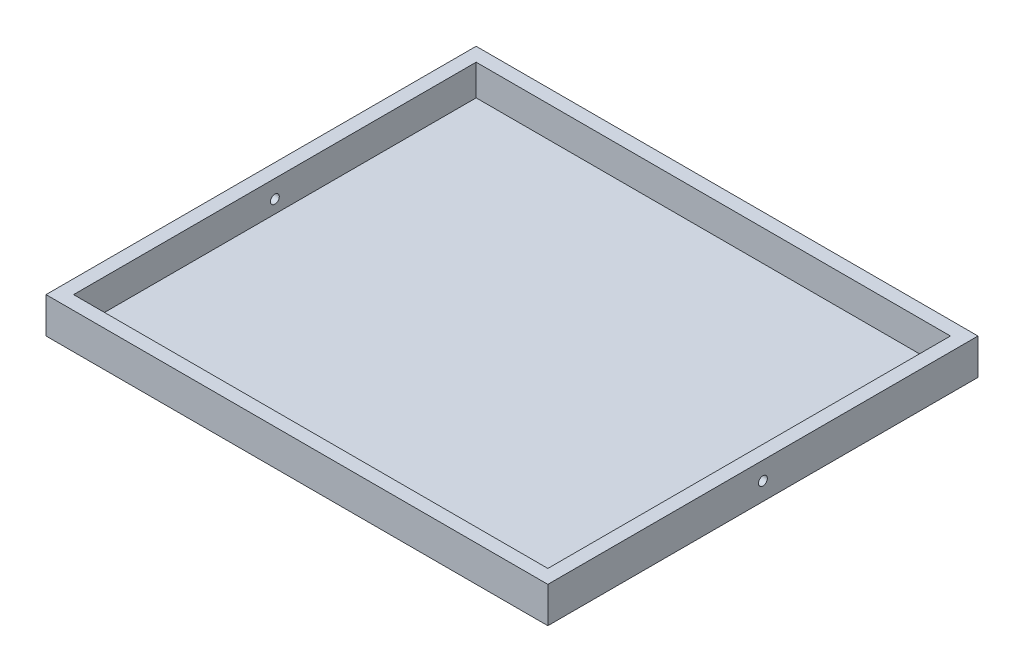
ISO-10303-21;
HEADER;
FILE_DESCRIPTION(('STEP AP214'),'2;1');
FILE_NAME('part.step','',(''),(''),'','','');
FILE_SCHEMA(('AUTOMOTIVE_DESIGN { 1 0 10303 214 1 1 1 1 }'));
ENDSEC;
DATA;
#1=APPLICATION_CONTEXT('core data for automotive mechanical design processes');
#2=APPLICATION_PROTOCOL_DEFINITION('international standard','automotive_design',2000,#1);
#3=PRODUCT_CONTEXT('',#1,'mechanical');
#4=PRODUCT('Part','Part','',(#3));
#5=PRODUCT_RELATED_PRODUCT_CATEGORY('part','',(#4));
#6=PRODUCT_DEFINITION_FORMATION('','',#4);
#7=PRODUCT_DEFINITION_CONTEXT('part definition',#1,'design');
#8=PRODUCT_DEFINITION('design','',#6,#7);
#9=PRODUCT_DEFINITION_SHAPE('','',#8);
#10=(LENGTH_UNIT() NAMED_UNIT(*) SI_UNIT(.MILLI.,.METRE.));
#11=(NAMED_UNIT(*) PLANE_ANGLE_UNIT() SI_UNIT($,.RADIAN.));
#12=(NAMED_UNIT(*) SI_UNIT($,.STERADIAN.) SOLID_ANGLE_UNIT());
#13=UNCERTAINTY_MEASURE_WITH_UNIT(LENGTH_MEASURE(1.E-05),#10,'distance_accuracy_value','');
#14=(GEOMETRIC_REPRESENTATION_CONTEXT(3) GLOBAL_UNCERTAINTY_ASSIGNED_CONTEXT((#13)) GLOBAL_UNIT_ASSIGNED_CONTEXT((#10,
#11,#12)) REPRESENTATION_CONTEXT('',''));
#15=CARTESIAN_POINT('',(0.,0.,0.));
#16=DIRECTION('',(0.,0.,1.));
#17=DIRECTION('',(1.,0.,0.));
#18=AXIS2_PLACEMENT_3D('',#15,#16,#17);
#19=CARTESIAN_POINT('',(-89.3605632411068,20.6375,-33.4056453318521));
#20=DIRECTION('',(1.,0.,0.));
#21=DIRECTION('',(0.,0.,-1.));
#22=AXIS2_PLACEMENT_3D('',#19,#20,#21);
#23=PLANE('',#22);
#24=CARTESIAN_POINT('',(-89.3605632411067,10.31875,82.481854668148));
#25=DIRECTION('',(1.,0.,0.));
#26=DIRECTION('',(0.,0.,-1.));
#27=AXIS2_PLACEMENT_3D('',#24,#25,#26);
#28=CIRCLE('',#27,2.54);
#29=CARTESIAN_POINT('',(-89.3605632411067,10.31875,79.941854668148));
#30=VERTEX_POINT('',#29);
#31=EDGE_CURVE('E118',#30,#30,#28,.T.);
#32=ORIENTED_EDGE('',*,*,#31,.F.);
#33=EDGE_LOOP('',(#32));
#34=FACE_BOUND('',#33,.T.);
#35=DIRECTION('',(0.,-1.,0.));
#36=VECTOR('',#35,1.);
#37=CARTESIAN_POINT('',(-89.3605632411067,20.6375,198.369354668148));
#38=LINE('',#37,#36);
#39=CARTESIAN_POINT('',(-89.3605632411067,20.6375,198.369354668148));
#40=VERTEX_POINT('',#39);
#41=CARTESIAN_POINT('',(-89.3605632411067,2.83961675484079,198.369354668148));
#42=VERTEX_POINT('',#41);
#43=EDGE_CURVE('E116',#40,#42,#38,.T.);
#44=ORIENTED_EDGE('',*,*,#43,.T.);
#45=DIRECTION('',(0.,0.,1.));
#46=VECTOR('',#45,1.);
#47=CARTESIAN_POINT('',(-89.3605632411067,2.83961675484079,198.369354668148));
#48=LINE('',#47,#46);
#49=CARTESIAN_POINT('',(-89.3605632411068,2.83961675484079,-33.4056453318521));
#50=VERTEX_POINT('',#49);
#51=EDGE_CURVE('E104',#50,#42,#48,.T.);
#52=ORIENTED_EDGE('',*,*,#51,.F.);
#53=DIRECTION('',(0.,-1.,0.));
#54=VECTOR('',#53,1.);
#55=CARTESIAN_POINT('',(-89.3605632411068,20.6375,-33.4056453318521));
#56=LINE('',#55,#54);
#57=CARTESIAN_POINT('',(-89.3605632411068,20.6375,-33.4056453318521));
#58=VERTEX_POINT('',#57);
#59=EDGE_CURVE('E113',#58,#50,#56,.T.);
#60=ORIENTED_EDGE('',*,*,#59,.F.);
#61=DIRECTION('',(0.,0.,1.));
#62=VECTOR('',#61,1.);
#63=CARTESIAN_POINT('',(-89.3605632411068,20.6375,-33.4056453318521));
#64=LINE('',#63,#62);
#65=EDGE_CURVE('E250',#58,#40,#64,.T.);
#66=ORIENTED_EDGE('',*,*,#65,.T.);
#67=EDGE_LOOP('',(#44,#52,#60,#66));
#68=FACE_BOUND('',#67,.T.);
#69=ADVANCED_FACE('F38',(#34,#68),#23,.T.);
#70=CARTESIAN_POINT('',(-89.3605632411067,20.6375,198.369354668148));
#71=DIRECTION('',(0.,0.,-1.));
#72=DIRECTION('',(-1.,0.,0.));
#73=AXIS2_PLACEMENT_3D('',#70,#71,#72);
#74=PLANE('',#73);
#75=DIRECTION('',(0.,-1.,0.));
#76=VECTOR('',#75,1.);
#77=CARTESIAN_POINT('',(183.689436758893,20.6375,198.369354668148));
#78=LINE('',#77,#76);
#79=CARTESIAN_POINT('',(183.689436758893,20.6375,198.369354668148));
#80=VERTEX_POINT('',#79);
#81=CARTESIAN_POINT('',(183.689436758893,2.83961675484079,198.369354668148));
#82=VERTEX_POINT('',#81);
#83=EDGE_CURVE('E127',#80,#82,#78,.T.);
#84=ORIENTED_EDGE('',*,*,#83,.T.);
#85=DIRECTION('',(-1.,0.,0.));
#86=VECTOR('',#85,1.);
#87=CARTESIAN_POINT('',(415.481831043767,2.83961675484079,198.369354668148));
#88=LINE('',#87,#86);
#89=EDGE_CURVE('E108',#82,#42,#88,.T.);
#90=ORIENTED_EDGE('',*,*,#89,.T.);
#91=ORIENTED_EDGE('',*,*,#43,.F.);
#92=DIRECTION('',(1.,0.,0.));
#93=VECTOR('',#92,1.);
#94=CARTESIAN_POINT('',(-89.3605632411067,20.6375,198.369354668148));
#95=LINE('',#94,#93);
#96=EDGE_CURVE('E249',#40,#80,#95,.T.);
#97=ORIENTED_EDGE('',*,*,#96,.T.);
#98=EDGE_LOOP('',(#84,#90,#91,#97));
#99=FACE_BOUND('',#98,.T.);
#100=ADVANCED_FACE('F206',(#99),#74,.T.);
#101=CARTESIAN_POINT('',(183.689436758893,20.6375,-33.4056453318521));
#102=DIRECTION('',(-1.,0.,0.));
#103=DIRECTION('',(0.,0.,1.));
#104=AXIS2_PLACEMENT_3D('',#101,#102,#103);
#105=PLANE('',#104);
#106=CARTESIAN_POINT('',(183.689436758893,10.31875,82.4818546681479));
#107=DIRECTION('',(-1.,0.,0.));
#108=DIRECTION('',(0.,0.,1.));
#109=AXIS2_PLACEMENT_3D('',#106,#107,#108);
#110=CIRCLE('',#109,2.54);
#111=CARTESIAN_POINT('',(183.689436758893,10.31875,85.021854668148));
#112=VERTEX_POINT('',#111);
#113=EDGE_CURVE('E244',#112,#112,#110,.T.);
#114=ORIENTED_EDGE('',*,*,#113,.F.);
#115=EDGE_LOOP('',(#114));
#116=FACE_BOUND('',#115,.T.);
#117=DIRECTION('',(0.,-1.,0.));
#118=VECTOR('',#117,1.);
#119=CARTESIAN_POINT('',(183.689436758893,20.6375,-33.4056453318521));
#120=LINE('',#119,#118);
#121=CARTESIAN_POINT('',(183.689436758893,20.6375,-33.4056453318521));
#122=VERTEX_POINT('',#121);
#123=CARTESIAN_POINT('',(183.689436758893,2.83961675484079,-33.4056453318521));
#124=VERTEX_POINT('',#123);
#125=EDGE_CURVE('E61',#122,#124,#120,.T.);
#126=ORIENTED_EDGE('',*,*,#125,.T.);
#127=DIRECTION('',(0.,0.,-1.));
#128=VECTOR('',#127,1.);
#129=CARTESIAN_POINT('',(183.689436758893,2.83961675484079,198.369354668148));
#130=LINE('',#129,#128);
#131=EDGE_CURVE('E54',#82,#124,#130,.T.);
#132=ORIENTED_EDGE('',*,*,#131,.F.);
#133=ORIENTED_EDGE('',*,*,#83,.F.);
#134=DIRECTION('',(0.,0.,-1.));
#135=VECTOR('',#134,1.);
#136=CARTESIAN_POINT('',(183.689436758893,20.6375,-33.4056453318521));
#137=LINE('',#136,#135);
#138=EDGE_CURVE('E129',#80,#122,#137,.T.);
#139=ORIENTED_EDGE('',*,*,#138,.T.);
#140=EDGE_LOOP('',(#126,#132,#133,#139));
#141=FACE_BOUND('',#140,.T.);
#142=ADVANCED_FACE('F214',(#116,#141),#105,.T.);
#143=CARTESIAN_POINT('',(-89.3605632411068,20.6375,-33.4056453318521));
#144=DIRECTION('',(0.,0.,1.));
#145=DIRECTION('',(1.,0.,0.));
#146=AXIS2_PLACEMENT_3D('',#143,#144,#145);
#147=PLANE('',#146);
#148=ORIENTED_EDGE('',*,*,#59,.T.);
#149=DIRECTION('',(-1.,0.,0.));
#150=VECTOR('',#149,1.);
#151=CARTESIAN_POINT('',(415.481831043767,2.83961675484079,-33.4056453318521));
#152=LINE('',#151,#150);
#153=EDGE_CURVE('E101',#124,#50,#152,.T.);
#154=ORIENTED_EDGE('',*,*,#153,.F.);
#155=ORIENTED_EDGE('',*,*,#125,.F.);
#156=DIRECTION('',(-1.,0.,0.));
#157=VECTOR('',#156,1.);
#158=CARTESIAN_POINT('',(-89.3605632411068,20.6375,-33.4056453318521));
#159=LINE('',#158,#157);
#160=EDGE_CURVE('E122',#122,#58,#159,.T.);
#161=ORIENTED_EDGE('',*,*,#160,.T.);
#162=EDGE_LOOP('',(#148,#154,#155,#161));
#163=FACE_BOUND('',#162,.T.);
#164=ADVANCED_FACE('F120',(#163),#147,.T.);
#165=CARTESIAN_POINT('',(0.,20.6375,0.));
#166=DIRECTION('',(0.,1.,0.));
#167=DIRECTION('',(0.,0.,1.));
#168=AXIS2_PLACEMENT_3D('',#165,#166,#167);
#169=PLANE('',#168);
#170=DIRECTION('',(0.,0.,1.));
#171=VECTOR('',#170,1.);
#172=CARTESIAN_POINT('',(-97.2980632411068,20.6375,-41.3431453318521));
#173=LINE('',#172,#171);
#174=CARTESIAN_POINT('',(-97.2980632411068,20.6375,-41.3431453318521));
#175=VERTEX_POINT('',#174);
#176=CARTESIAN_POINT('',(-97.2980632411067,20.6375,206.306854668148));
#177=VERTEX_POINT('',#176);
#178=EDGE_CURVE('E139',#175,#177,#173,.T.);
#179=ORIENTED_EDGE('',*,*,#178,.T.);
#180=DIRECTION('',(1.,0.,0.));
#181=VECTOR('',#180,1.);
#182=CARTESIAN_POINT('',(-97.2980632411067,20.6375,206.306854668148));
#183=LINE('',#182,#181);
#184=CARTESIAN_POINT('',(191.626936758893,20.6375,206.306854668148));
#185=VERTEX_POINT('',#184);
#186=EDGE_CURVE('E143',#177,#185,#183,.T.);
#187=ORIENTED_EDGE('',*,*,#186,.T.);
#188=DIRECTION('',(0.,0.,-1.));
#189=VECTOR('',#188,1.);
#190=CARTESIAN_POINT('',(191.626936758893,20.6375,-41.3431453318521));
#191=LINE('',#190,#189);
#192=CARTESIAN_POINT('',(191.626936758893,20.6375,-41.3431453318521));
#193=VERTEX_POINT('',#192);
#194=EDGE_CURVE('E147',#185,#193,#191,.T.);
#195=ORIENTED_EDGE('',*,*,#194,.T.);
#196=DIRECTION('',(-1.,0.,0.));
#197=VECTOR('',#196,1.);
#198=CARTESIAN_POINT('',(-97.2980632411068,20.6375,-41.3431453318521));
#199=LINE('',#198,#197);
#200=EDGE_CURVE('E150',#193,#175,#199,.T.);
#201=ORIENTED_EDGE('',*,*,#200,.T.);
#202=EDGE_LOOP('',(#179,#187,#195,#201));
#203=FACE_BOUND('',#202,.T.);
#204=ORIENTED_EDGE('',*,*,#96,.F.);
#205=ORIENTED_EDGE('',*,*,#65,.F.);
#206=ORIENTED_EDGE('',*,*,#160,.F.);
#207=ORIENTED_EDGE('',*,*,#138,.F.);
#208=EDGE_LOOP('',(#204,#205,#206,#207));
#209=FACE_BOUND('',#208,.T.);
#210=ADVANCED_FACE('F192',(#203,#209),#169,.T.);
#211=CARTESIAN_POINT('',(0.,0.,0.));
#212=DIRECTION('',(0.,1.,0.));
#213=DIRECTION('',(0.,0.,1.));
#214=AXIS2_PLACEMENT_3D('',#211,#212,#213);
#215=PLANE('',#214);
#216=DIRECTION('',(0.,0.,1.));
#217=VECTOR('',#216,1.);
#218=CARTESIAN_POINT('',(-97.2980632411068,0.,-41.3431453318521));
#219=LINE('',#218,#217);
#220=CARTESIAN_POINT('',(-97.2980632411068,0.,-41.3431453318521));
#221=VERTEX_POINT('',#220);
#222=CARTESIAN_POINT('',(-97.2980632411067,0.,206.306854668148));
#223=VERTEX_POINT('',#222);
#224=EDGE_CURVE('E138',#221,#223,#219,.T.);
#225=ORIENTED_EDGE('',*,*,#224,.F.);
#226=DIRECTION('',(-1.,0.,0.));
#227=VECTOR('',#226,1.);
#228=CARTESIAN_POINT('',(-97.2980632411068,0.,-41.3431453318521));
#229=LINE('',#228,#227);
#230=CARTESIAN_POINT('',(191.626936758893,0.,-41.3431453318521));
#231=VERTEX_POINT('',#230);
#232=EDGE_CURVE('E144',#231,#221,#229,.T.);
#233=ORIENTED_EDGE('',*,*,#232,.F.);
#234=DIRECTION('',(0.,0.,-1.));
#235=VECTOR('',#234,1.);
#236=CARTESIAN_POINT('',(191.626936758893,0.,-41.3431453318521));
#237=LINE('',#236,#235);
#238=CARTESIAN_POINT('',(191.626936758893,0.,206.306854668148));
#239=VERTEX_POINT('',#238);
#240=EDGE_CURVE('E160',#239,#231,#237,.T.);
#241=ORIENTED_EDGE('',*,*,#240,.F.);
#242=DIRECTION('',(1.,0.,0.));
#243=VECTOR('',#242,1.);
#244=CARTESIAN_POINT('',(-97.2980632411067,0.,206.306854668148));
#245=LINE('',#244,#243);
#246=EDGE_CURVE('E157',#223,#239,#245,.T.);
#247=ORIENTED_EDGE('',*,*,#246,.F.);
#248=EDGE_LOOP('',(#225,#233,#241,#247));
#249=FACE_BOUND('',#248,.T.);
#250=ADVANCED_FACE('F183',(#249),#215,.F.);
#251=CARTESIAN_POINT('',(-97.2980632411068,20.6375,-41.3431453318521));
#252=DIRECTION('',(1.,0.,0.));
#253=DIRECTION('',(0.,0.,-1.));
#254=AXIS2_PLACEMENT_3D('',#251,#252,#253);
#255=PLANE('',#254);
#256=CARTESIAN_POINT('',(-97.2980632411068,10.31875,82.481854668148));
#257=DIRECTION('',(1.,0.,0.));
#258=DIRECTION('',(0.,0.,-1.));
#259=AXIS2_PLACEMENT_3D('',#256,#257,#258);
#260=CIRCLE('',#259,2.54);
#261=CARTESIAN_POINT('',(-97.2980632411068,10.31875,79.941854668148));
#262=VERTEX_POINT('',#261);
#263=EDGE_CURVE('E265',#262,#262,#260,.T.);
#264=ORIENTED_EDGE('',*,*,#263,.T.);
#265=EDGE_LOOP('',(#264));
#266=FACE_BOUND('',#265,.T.);
#267=ORIENTED_EDGE('',*,*,#224,.T.);
#268=DIRECTION('',(0.,-1.,0.));
#269=VECTOR('',#268,1.);
#270=CARTESIAN_POINT('',(-97.2980632411067,20.6375,206.306854668148));
#271=LINE('',#270,#269);
#272=EDGE_CURVE('E11',#177,#223,#271,.T.);
#273=ORIENTED_EDGE('',*,*,#272,.F.);
#274=ORIENTED_EDGE('',*,*,#178,.F.);
#275=DIRECTION('',(0.,-1.,0.));
#276=VECTOR('',#275,1.);
#277=CARTESIAN_POINT('',(-97.2980632411068,20.6375,-41.3431453318521));
#278=LINE('',#277,#276);
#279=EDGE_CURVE('E153',#175,#221,#278,.T.);
#280=ORIENTED_EDGE('',*,*,#279,.T.);
#281=EDGE_LOOP('',(#267,#273,#274,#280));
#282=FACE_BOUND('',#281,.T.);
#283=ADVANCED_FACE('F40',(#266,#282),#255,.F.);
#284=CARTESIAN_POINT('',(-97.2980632411067,20.6375,206.306854668148));
#285=DIRECTION('',(0.,0.,-1.));
#286=DIRECTION('',(-1.,0.,0.));
#287=AXIS2_PLACEMENT_3D('',#284,#285,#286);
#288=PLANE('',#287);
#289=ORIENTED_EDGE('',*,*,#246,.T.);
#290=DIRECTION('',(0.,-1.,0.));
#291=VECTOR('',#290,1.);
#292=CARTESIAN_POINT('',(191.626936758893,20.6375,206.306854668148));
#293=LINE('',#292,#291);
#294=EDGE_CURVE('E47',#185,#239,#293,.T.);
#295=ORIENTED_EDGE('',*,*,#294,.F.);
#296=ORIENTED_EDGE('',*,*,#186,.F.);
#297=ORIENTED_EDGE('',*,*,#272,.T.);
#298=EDGE_LOOP('',(#289,#295,#296,#297));
#299=FACE_BOUND('',#298,.T.);
#300=ADVANCED_FACE('F194',(#299),#288,.F.);
#301=CARTESIAN_POINT('',(191.626936758893,20.6375,-41.3431453318521));
#302=DIRECTION('',(-1.,0.,0.));
#303=DIRECTION('',(0.,0.,1.));
#304=AXIS2_PLACEMENT_3D('',#301,#302,#303);
#305=PLANE('',#304);
#306=CARTESIAN_POINT('',(191.626936758893,10.31875,82.4818546681479));
#307=DIRECTION('',(1.,0.,0.));
#308=DIRECTION('',(0.,0.,-1.));
#309=AXIS2_PLACEMENT_3D('',#306,#307,#308);
#310=CIRCLE('',#309,2.54);
#311=CARTESIAN_POINT('',(191.626936758893,10.31875,79.9418546681479));
#312=VERTEX_POINT('',#311);
#313=EDGE_CURVE('E266',#312,#312,#310,.T.);
#314=ORIENTED_EDGE('',*,*,#313,.F.);
#315=EDGE_LOOP('',(#314));
#316=FACE_BOUND('',#315,.T.);
#317=ORIENTED_EDGE('',*,*,#240,.T.);
#318=DIRECTION('',(0.,-1.,0.));
#319=VECTOR('',#318,1.);
#320=CARTESIAN_POINT('',(191.626936758893,20.6375,-41.3431453318521));
#321=LINE('',#320,#319);
#322=EDGE_CURVE('E168',#193,#231,#321,.T.);
#323=ORIENTED_EDGE('',*,*,#322,.F.);
#324=ORIENTED_EDGE('',*,*,#194,.F.);
#325=ORIENTED_EDGE('',*,*,#294,.T.);
#326=EDGE_LOOP('',(#317,#323,#324,#325));
#327=FACE_BOUND('',#326,.T.);
#328=ADVANCED_FACE('F177',(#316,#327),#305,.F.);
#329=CARTESIAN_POINT('',(-97.2980632411068,20.6375,-41.3431453318521));
#330=DIRECTION('',(0.,0.,1.));
#331=DIRECTION('',(1.,0.,0.));
#332=AXIS2_PLACEMENT_3D('',#329,#330,#331);
#333=PLANE('',#332);
#334=ORIENTED_EDGE('',*,*,#232,.T.);
#335=ORIENTED_EDGE('',*,*,#279,.F.);
#336=ORIENTED_EDGE('',*,*,#200,.F.);
#337=ORIENTED_EDGE('',*,*,#322,.T.);
#338=EDGE_LOOP('',(#334,#335,#336,#337));
#339=FACE_BOUND('',#338,.T.);
#340=ADVANCED_FACE('F186',(#339),#333,.F.);
#341=CARTESIAN_POINT('',(415.481831043767,2.83961675484079,198.369354668148));
#342=DIRECTION('',(0.,-1.,0.));
#343=DIRECTION('',(0.,0.,-1.));
#344=AXIS2_PLACEMENT_3D('',#341,#342,#343);
#345=PLANE('',#344);
#346=ORIENTED_EDGE('',*,*,#89,.F.);
#347=ORIENTED_EDGE('',*,*,#131,.T.);
#348=ORIENTED_EDGE('',*,*,#153,.T.);
#349=ORIENTED_EDGE('',*,*,#51,.T.);
#350=EDGE_LOOP('',(#346,#347,#348,#349));
#351=FACE_BOUND('',#350,.T.);
#352=ADVANCED_FACE('F103',(#351),#345,.F.);
#353=CARTESIAN_POINT('',(-97.2980632411068,10.31875,82.481854668148));
#354=DIRECTION('',(1.,0.,0.));
#355=DIRECTION('',(0.,0.,-1.));
#356=AXIS2_PLACEMENT_3D('',#353,#354,#355);
#357=CYLINDRICAL_SURFACE('',#356,2.54);
#358=ORIENTED_EDGE('',*,*,#113,.T.);
#359=EDGE_LOOP('',(#358));
#360=FACE_BOUND('',#359,.T.);
#361=ORIENTED_EDGE('',*,*,#313,.T.);
#362=EDGE_LOOP('',(#361));
#363=FACE_BOUND('',#362,.T.);
#364=ADVANCED_FACE('F229',(#360,#363),#357,.F.);
#365=ORIENTED_EDGE('',*,*,#31,.T.);
#366=EDGE_LOOP('',(#365));
#367=FACE_BOUND('',#366,.T.);
#368=ORIENTED_EDGE('',*,*,#263,.F.);
#369=EDGE_LOOP('',(#368));
#370=FACE_BOUND('',#369,.T.);
#371=ADVANCED_FACE('F233',(#367,#370),#357,.F.);
#372=CLOSED_SHELL('',(#69,#100,#142,#164,#210,#250,#283,#300,#328,#340,#352,#364,#371));
#373=MANIFOLD_SOLID_BREP('B2',#372);
#374=ADVANCED_BREP_SHAPE_REPRESENTATION('',(#18,#373),#14);
#375=SHAPE_DEFINITION_REPRESENTATION(#9,#374);
ENDSEC;
END-ISO-10303-21;
